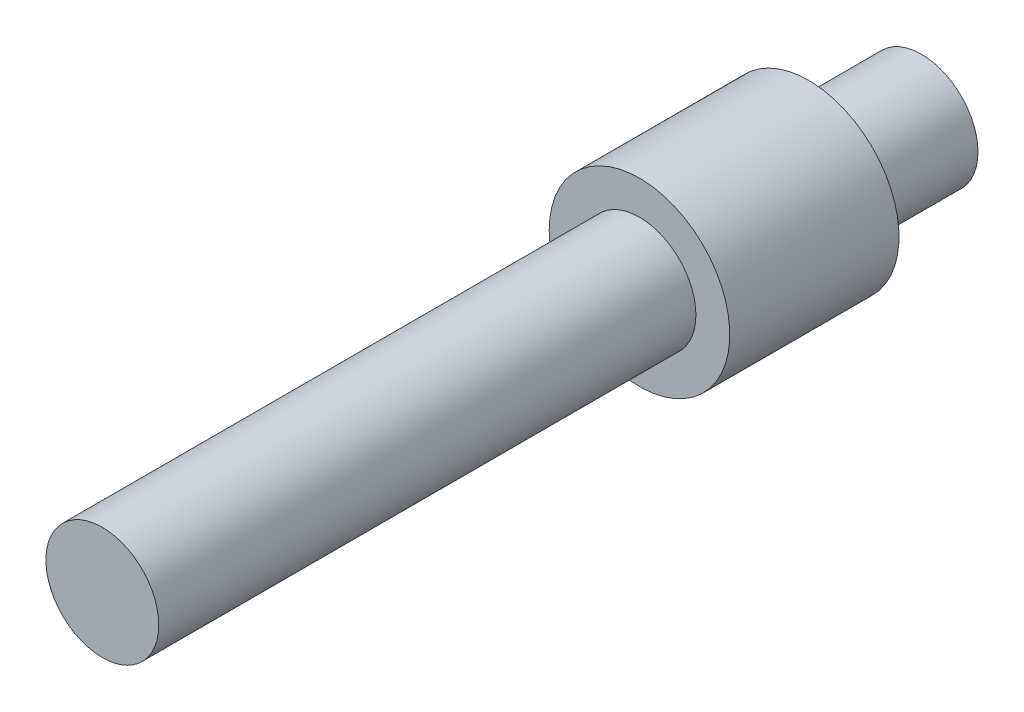
ISO-10303-21;
HEADER;
FILE_DESCRIPTION(('STEP AP214'),'2;1');
FILE_NAME('part.step','',(''),(''),'','','');
FILE_SCHEMA(('AUTOMOTIVE_DESIGN { 1 0 10303 214 1 1 1 1 }'));
ENDSEC;
DATA;
#1=APPLICATION_CONTEXT('core data for automotive mechanical design processes');
#2=APPLICATION_PROTOCOL_DEFINITION('international standard','automotive_design',2000,#1);
#3=PRODUCT_CONTEXT('',#1,'mechanical');
#4=PRODUCT('Part','Part','',(#3));
#5=PRODUCT_RELATED_PRODUCT_CATEGORY('part','',(#4));
#6=PRODUCT_DEFINITION_FORMATION('','',#4);
#7=PRODUCT_DEFINITION_CONTEXT('part definition',#1,'design');
#8=PRODUCT_DEFINITION('design','',#6,#7);
#9=PRODUCT_DEFINITION_SHAPE('','',#8);
#10=(LENGTH_UNIT() NAMED_UNIT(*) SI_UNIT(.MILLI.,.METRE.));
#11=(NAMED_UNIT(*) PLANE_ANGLE_UNIT() SI_UNIT($,.RADIAN.));
#12=(NAMED_UNIT(*) SI_UNIT($,.STERADIAN.) SOLID_ANGLE_UNIT());
#13=UNCERTAINTY_MEASURE_WITH_UNIT(LENGTH_MEASURE(1.E-05),#10,'distance_accuracy_value','');
#14=(GEOMETRIC_REPRESENTATION_CONTEXT(3) GLOBAL_UNCERTAINTY_ASSIGNED_CONTEXT((#13)) GLOBAL_UNIT_ASSIGNED_CONTEXT((#10,
#11,#12)) REPRESENTATION_CONTEXT('',''));
#15=CARTESIAN_POINT('',(0.,0.,0.));
#16=DIRECTION('',(0.,0.,1.));
#17=DIRECTION('',(1.,0.,0.));
#18=AXIS2_PLACEMENT_3D('',#15,#16,#17);
#19=CARTESIAN_POINT('',(0.,0.,-92.202));
#20=DIRECTION('',(0.,0.,1.));
#21=DIRECTION('',(1.,0.,0.));
#22=AXIS2_PLACEMENT_3D('',#19,#20,#21);
#23=CYLINDRICAL_SURFACE('',#22,6.35);
#24=CARTESIAN_POINT('',(0.,0.,0.));
#25=DIRECTION('',(0.,0.,1.));
#26=DIRECTION('',(1.,0.,0.));
#27=AXIS2_PLACEMENT_3D('',#24,#25,#26);
#28=CIRCLE('',#27,6.35);
#29=CARTESIAN_POINT('',(6.35,0.,0.));
#30=VERTEX_POINT('',#29);
#31=EDGE_CURVE('E51',#30,#30,#28,.T.);
#32=ORIENTED_EDGE('',*,*,#31,.F.);
#33=EDGE_LOOP('',(#32));
#34=FACE_BOUND('',#33,.T.);
#35=CARTESIAN_POINT('',(0.,0.,-60.452));
#36=DIRECTION('',(0.,0.,-1.));
#37=DIRECTION('',(-1.,0.,0.));
#38=AXIS2_PLACEMENT_3D('',#35,#36,#37);
#39=CIRCLE('',#38,6.35);
#40=CARTESIAN_POINT('',(-6.35,0.,-60.452));
#41=VERTEX_POINT('',#40);
#42=EDGE_CURVE('E41',#41,#41,#39,.F.);
#43=ORIENTED_EDGE('',*,*,#42,.T.);
#44=EDGE_LOOP('',(#43));
#45=FACE_BOUND('',#44,.T.);
#46=ADVANCED_FACE('F37',(#34,#45),#23,.T.);
#47=CARTESIAN_POINT('',(0.,0.,0.));
#48=DIRECTION('',(0.,0.,1.));
#49=DIRECTION('',(1.,0.,0.));
#50=AXIS2_PLACEMENT_3D('',#47,#48,#49);
#51=PLANE('',#50);
#52=ORIENTED_EDGE('',*,*,#31,.T.);
#53=EDGE_LOOP('',(#52));
#54=FACE_BOUND('',#53,.T.);
#55=ADVANCED_FACE('F83',(#54),#51,.T.);
#56=CARTESIAN_POINT('',(0.,0.,-60.452));
#57=DIRECTION('',(0.,0.,-1.));
#58=DIRECTION('',(-1.,0.,0.));
#59=AXIS2_PLACEMENT_3D('',#56,#57,#58);
#60=CYLINDRICAL_SURFACE('',#59,10.16);
#61=CARTESIAN_POINT('',(0.,0.,-60.452));
#62=DIRECTION('',(0.,0.,-1.));
#63=DIRECTION('',(-1.,0.,0.));
#64=AXIS2_PLACEMENT_3D('',#61,#62,#63);
#65=CIRCLE('',#64,10.16);
#66=CARTESIAN_POINT('',(-10.16,0.,-60.452));
#67=VERTEX_POINT('',#66);
#68=EDGE_CURVE('E61',#67,#67,#65,.T.);
#69=CARTESIAN_POINT('',(0.,0.,-79.502));
#70=DIRECTION('',(0.,0.,-1.));
#71=DIRECTION('',(-1.,0.,0.));
#72=AXIS2_PLACEMENT_3D('',#69,#70,#71);
#73=CIRCLE('',#72,10.16);
#74=CARTESIAN_POINT('',(-10.16,0.,-79.502));
#75=VERTEX_POINT('',#74);
#76=EDGE_CURVE('E57',#75,#75,#73,.T.);
#77=CARTESIAN_POINT('',(-10.16,0.,-60.452));
#78=CARTESIAN_POINT('',(-10.16,0.,-60.6504375));
#79=CARTESIAN_POINT('',(-10.16,0.,-60.848875));
#80=CARTESIAN_POINT('',(-10.16,0.,-61.24575));
#81=CARTESIAN_POINT('',(-10.16,0.,-61.4441875));
#82=CARTESIAN_POINT('',(-10.16,0.,-61.8410625));
#83=CARTESIAN_POINT('',(-10.16,0.,-62.0395));
#84=CARTESIAN_POINT('',(-10.16,0.,-62.436375));
#85=CARTESIAN_POINT('',(-10.16,0.,-62.6348125));
#86=CARTESIAN_POINT('',(-10.16,0.,-63.0316875));
#87=CARTESIAN_POINT('',(-10.16,0.,-63.230125));
#88=CARTESIAN_POINT('',(-10.16,0.,-63.627));
#89=CARTESIAN_POINT('',(-10.16,0.,-63.8254375));
#90=CARTESIAN_POINT('',(-10.16,0.,-64.2223125));
#91=CARTESIAN_POINT('',(-10.16,0.,-64.42075));
#92=CARTESIAN_POINT('',(-10.16,0.,-64.817625));
#93=CARTESIAN_POINT('',(-10.16,0.,-65.0160625));
#94=CARTESIAN_POINT('',(-10.16,0.,-65.4129375));
#95=CARTESIAN_POINT('',(-10.16,0.,-65.611375));
#96=CARTESIAN_POINT('',(-10.16,0.,-66.00825));
#97=CARTESIAN_POINT('',(-10.16,0.,-66.2066875));
#98=CARTESIAN_POINT('',(-10.16,0.,-66.6035625));
#99=CARTESIAN_POINT('',(-10.16,0.,-66.802));
#100=CARTESIAN_POINT('',(-10.16,0.,-67.198875));
#101=CARTESIAN_POINT('',(-10.16,0.,-67.3973125));
#102=CARTESIAN_POINT('',(-10.16,0.,-67.7941875));
#103=CARTESIAN_POINT('',(-10.16,0.,-67.992625));
#104=CARTESIAN_POINT('',(-10.16,0.,-68.3895));
#105=CARTESIAN_POINT('',(-10.16,0.,-68.5879375));
#106=CARTESIAN_POINT('',(-10.16,0.,-68.9848125));
#107=CARTESIAN_POINT('',(-10.16,0.,-69.18325));
#108=CARTESIAN_POINT('',(-10.16,0.,-69.580125));
#109=CARTESIAN_POINT('',(-10.16,0.,-69.7785625));
#110=CARTESIAN_POINT('',(-10.16,0.,-70.1754375));
#111=CARTESIAN_POINT('',(-10.16,0.,-70.373875));
#112=CARTESIAN_POINT('',(-10.16,0.,-70.77075));
#113=CARTESIAN_POINT('',(-10.16,0.,-70.9691875));
#114=CARTESIAN_POINT('',(-10.16,0.,-71.3660625));
#115=CARTESIAN_POINT('',(-10.16,0.,-71.5645));
#116=CARTESIAN_POINT('',(-10.16,0.,-71.961375));
#117=CARTESIAN_POINT('',(-10.16,0.,-72.1598125));
#118=CARTESIAN_POINT('',(-10.16,0.,-72.5566875));
#119=CARTESIAN_POINT('',(-10.16,0.,-72.755125));
#120=CARTESIAN_POINT('',(-10.16,0.,-73.152));
#121=CARTESIAN_POINT('',(-10.16,0.,-73.3504375));
#122=CARTESIAN_POINT('',(-10.16,0.,-73.7473125));
#123=CARTESIAN_POINT('',(-10.16,0.,-73.94575));
#124=CARTESIAN_POINT('',(-10.16,0.,-74.342625));
#125=CARTESIAN_POINT('',(-10.16,0.,-74.5410625));
#126=CARTESIAN_POINT('',(-10.16,0.,-74.9379375));
#127=CARTESIAN_POINT('',(-10.16,0.,-75.136375));
#128=CARTESIAN_POINT('',(-10.16,0.,-75.53325));
#129=CARTESIAN_POINT('',(-10.16,0.,-75.7316875));
#130=CARTESIAN_POINT('',(-10.16,0.,-76.1285625));
#131=CARTESIAN_POINT('',(-10.16,0.,-76.327));
#132=CARTESIAN_POINT('',(-10.16,0.,-76.723875));
#133=CARTESIAN_POINT('',(-10.16,0.,-76.9223125));
#134=CARTESIAN_POINT('',(-10.16,0.,-77.3191875));
#135=CARTESIAN_POINT('',(-10.16,0.,-77.517625));
#136=CARTESIAN_POINT('',(-10.16,0.,-77.9145));
#137=CARTESIAN_POINT('',(-10.16,0.,-78.1129375));
#138=CARTESIAN_POINT('',(-10.16,0.,-78.5098125));
#139=CARTESIAN_POINT('',(-10.16,0.,-78.70825));
#140=CARTESIAN_POINT('',(-10.16,0.,-79.105125));
#141=CARTESIAN_POINT('',(-10.16,0.,-79.3035625));
#142=CARTESIAN_POINT('',(-10.16,0.,-79.502));
#143=B_SPLINE_CURVE_WITH_KNOTS('',3,(#77,#78,#79,#80,#81,#82,#83,#84,#85,#86,#87,#88,#89,#90,
#91,#92,#93,#94,#95,#96,#97,#98,#99,#100,#101,#102,#103,#104,#105,#106,#107,#108,#109,#110,#111,
#112,#113,#114,#115,#116,#117,#118,#119,#120,#121,#122,#123,#124,#125,#126,#127,#128,#129,#130,
#131,#132,#133,#134,#135,#136,#137,#138,#139,#140,#141,#142),.UNSPECIFIED.,.F.,.F.,(4,2,2,2,2,2,
2,2,2,2,2,2,2,2,2,2,2,2,2,2,2,2,2,2,2,2,2,2,2,2,2,2,4),(0.,0.595312499999993,1.19062499999999,
1.78593749999999,2.38125,2.9765625,3.57187499999999,4.16718749999999,4.76249999999999,
5.35781249999999,5.95312499999999,6.54843749999999,7.14374999999999,7.73906249999999,
8.33437499999999,8.92968749999999,9.52499999999999,10.1203125,10.715625,11.3109375,11.90625,
12.5015625,13.096875,13.6921875,14.2875,14.8828125,15.478125,16.0734375,16.66875,17.2640625,
17.859375,18.4546875,19.05),.UNSPECIFIED.);
#144=EDGE_CURVE('BSEAM75',#67,#75,#143,.T.);
#145=ORIENTED_EDGE('',*,*,#68,.T.);
#146=ORIENTED_EDGE('',*,*,#76,.F.);
#147=ORIENTED_EDGE('',*,*,#144,.T.);
#148=ORIENTED_EDGE('',*,*,#144,.F.);
#149=EDGE_LOOP('',(#145,#147,#146,#148));
#150=FACE_BOUND('',#149,.T.);
#151=ADVANCED_FACE('F75',(#150),#60,.T.);
#152=CARTESIAN_POINT('',(0.,0.,-60.452));
#153=DIRECTION('',(0.,0.,-1.));
#154=DIRECTION('',(-1.,0.,0.));
#155=AXIS2_PLACEMENT_3D('',#152,#153,#154);
#156=PLANE('',#155);
#157=ORIENTED_EDGE('',*,*,#42,.F.);
#158=EDGE_LOOP('',(#157));
#159=FACE_BOUND('',#158,.T.);
#160=ORIENTED_EDGE('',*,*,#68,.F.);
#161=EDGE_LOOP('',(#160));
#162=FACE_BOUND('',#161,.T.);
#163=ADVANCED_FACE('F71',(#159,#162),#156,.F.);
#164=CARTESIAN_POINT('',(0.,0.,-79.502));
#165=DIRECTION('',(0.,0.,-1.));
#166=DIRECTION('',(-1.,0.,0.));
#167=AXIS2_PLACEMENT_3D('',#164,#165,#166);
#168=PLANE('',#167);
#169=CARTESIAN_POINT('',(0.,0.,-79.502));
#170=DIRECTION('',(0.,0.,-1.));
#171=DIRECTION('',(-1.,0.,0.));
#172=AXIS2_PLACEMENT_3D('',#169,#170,#171);
#173=CIRCLE('',#172,6.35);
#174=CARTESIAN_POINT('',(-6.35,0.,-79.502));
#175=VERTEX_POINT('',#174);
#176=EDGE_CURVE('E10',#175,#175,#173,.F.);
#177=ORIENTED_EDGE('',*,*,#176,.T.);
#178=EDGE_LOOP('',(#177));
#179=FACE_BOUND('',#178,.T.);
#180=ORIENTED_EDGE('',*,*,#76,.T.);
#181=EDGE_LOOP('',(#180));
#182=FACE_BOUND('',#181,.T.);
#183=ADVANCED_FACE('F74',(#179,#182),#168,.T.);
#184=CARTESIAN_POINT('',(0.,0.,-92.202));
#185=DIRECTION('',(0.,0.,1.));
#186=DIRECTION('',(1.,0.,0.));
#187=AXIS2_PLACEMENT_3D('',#184,#185,#186);
#188=PLANE('',#187);
#189=CARTESIAN_POINT('',(0.,0.,-92.202));
#190=DIRECTION('',(0.,0.,1.));
#191=DIRECTION('',(1.,0.,0.));
#192=AXIS2_PLACEMENT_3D('',#189,#190,#191);
#193=CIRCLE('',#192,6.35);
#194=CARTESIAN_POINT('',(6.35,0.,-92.202));
#195=VERTEX_POINT('',#194);
#196=EDGE_CURVE('E46',#195,#195,#193,.T.);
#197=ORIENTED_EDGE('',*,*,#196,.F.);
#198=EDGE_LOOP('',(#197));
#199=FACE_BOUND('',#198,.T.);
#200=ADVANCED_FACE('F81',(#199),#188,.F.);
#201=ORIENTED_EDGE('',*,*,#176,.F.);
#202=EDGE_LOOP('',(#201));
#203=FACE_BOUND('',#202,.T.);
#204=ORIENTED_EDGE('',*,*,#196,.T.);
#205=EDGE_LOOP('',(#204));
#206=FACE_BOUND('',#205,.T.);
#207=ADVANCED_FACE('F39',(#203,#206),#23,.T.);
#208=CLOSED_SHELL('',(#46,#55,#151,#163,#183,#200,#207));
#209=MANIFOLD_SOLID_BREP('B2',#208);
#210=ADVANCED_BREP_SHAPE_REPRESENTATION('',(#18,#209),#14);
#211=SHAPE_DEFINITION_REPRESENTATION(#9,#210);
ENDSEC;
END-ISO-10303-21;
